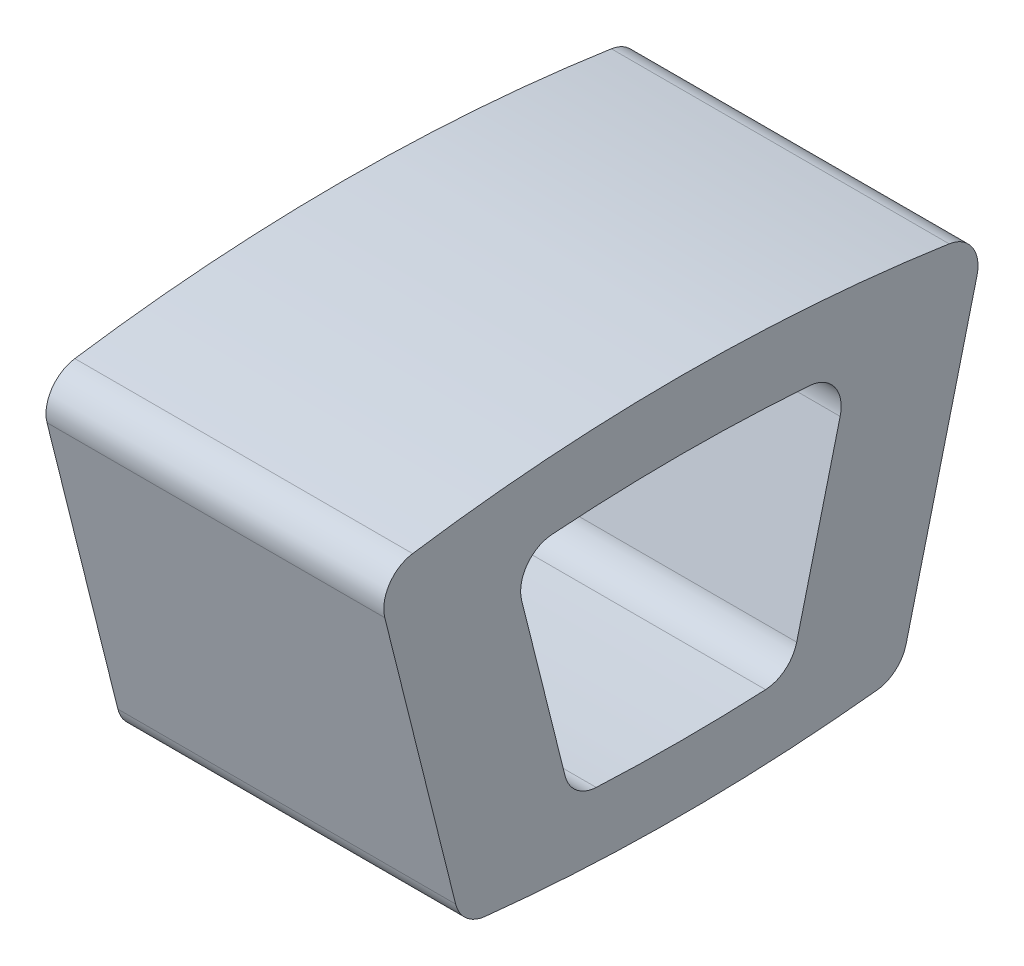
ISO-10303-21;
HEADER;
FILE_DESCRIPTION(('STEP AP214'),'2;1');
FILE_NAME('part.step','',(''),(''),'','','');
FILE_SCHEMA(('AUTOMOTIVE_DESIGN { 1 0 10303 214 1 1 1 1 }'));
ENDSEC;
DATA;
#1=APPLICATION_CONTEXT('core data for automotive mechanical design processes');
#2=APPLICATION_PROTOCOL_DEFINITION('international standard','automotive_design',2000,#1);
#3=PRODUCT_CONTEXT('',#1,'mechanical');
#4=PRODUCT('Part','Part','',(#3));
#5=PRODUCT_RELATED_PRODUCT_CATEGORY('part','',(#4));
#6=PRODUCT_DEFINITION_FORMATION('','',#4);
#7=PRODUCT_DEFINITION_CONTEXT('part definition',#1,'design');
#8=PRODUCT_DEFINITION('design','',#6,#7);
#9=PRODUCT_DEFINITION_SHAPE('','',#8);
#10=(LENGTH_UNIT() NAMED_UNIT(*) SI_UNIT(.MILLI.,.METRE.));
#11=(NAMED_UNIT(*) PLANE_ANGLE_UNIT() SI_UNIT($,.RADIAN.));
#12=(NAMED_UNIT(*) SI_UNIT($,.STERADIAN.) SOLID_ANGLE_UNIT());
#13=UNCERTAINTY_MEASURE_WITH_UNIT(LENGTH_MEASURE(1.E-05),#10,'distance_accuracy_value','');
#14=(GEOMETRIC_REPRESENTATION_CONTEXT(3) GLOBAL_UNCERTAINTY_ASSIGNED_CONTEXT((#13)) GLOBAL_UNIT_ASSIGNED_CONTEXT((#10,
#11,#12)) REPRESENTATION_CONTEXT('',''));
#15=CARTESIAN_POINT('',(0.,0.,0.));
#16=DIRECTION('',(0.,0.,1.));
#17=DIRECTION('',(1.,0.,0.));
#18=AXIS2_PLACEMENT_3D('',#15,#16,#17);
#19=CARTESIAN_POINT('',(40.,177.159717930252,-22.7918238569453));
#20=DIRECTION('',(1.,0.,0.));
#21=DIRECTION('',(0.,0.,-1.));
#22=AXIS2_PLACEMENT_3D('',#19,#20,#21);
#23=PLANE('',#22);
#24=CARTESIAN_POINT('',(40.,177.159717930252,-22.7918238569453));
#25=DIRECTION('',(1.,0.,0.));
#26=DIRECTION('',(0.,0.,-1.));
#27=AXIS2_PLACEMENT_3D('',#24,#25,#26);
#28=CIRCLE('',#27,4.00000000000001);
#29=CARTESIAN_POINT('',(40.,173.182678406543,-23.2197918777813));
#30=VERTEX_POINT('',#29);
#31=CARTESIAN_POINT('',(40.,176.189575430106,-26.6723938575266));
#32=VERTEX_POINT('',#31);
#33=EDGE_CURVE('E222',#30,#32,#28,.T.);
#34=ORIENTED_EDGE('',*,*,#33,.T.);
#35=DIRECTION('',(0.,0.970142500145332,-0.242535625036332));
#36=VECTOR('',#35,1.);
#37=CARTESIAN_POINT('',(40.,176.189575430106,-26.6723938575266));
#38=LINE('',#37,#36);
#39=CARTESIAN_POINT('',(40.,209.758625875981,-35.0646564689952));
#40=VERTEX_POINT('',#39);
#41=EDGE_CURVE('E225',#32,#40,#38,.T.);
#42=ORIENTED_EDGE('',*,*,#41,.T.);
#43=CARTESIAN_POINT('',(40.,210.728768376126,-31.1840864684138));
#44=DIRECTION('',(1.,0.,0.));
#45=DIRECTION('',(0.,0.,1.));
#46=AXIS2_PLACEMENT_3D('',#43,#44,#45);
#47=CIRCLE('',#46,4.00000000000003);
#48=CARTESIAN_POINT('',(40.,214.685677419528,-31.7696381930689));
#49=VERTEX_POINT('',#48);
#50=EDGE_CURVE('E227',#40,#49,#47,.T.);
#51=ORIENTED_EDGE('',*,*,#50,.T.);
#52=CARTESIAN_POINT('',(40.,0.,0.));
#53=DIRECTION('',(1.,0.,0.));
#54=DIRECTION('',(0.,0.,1.));
#55=AXIS2_PLACEMENT_3D('',#52,#53,#54);
#56=CIRCLE('',#55,217.023616226437);
#57=CARTESIAN_POINT('',(40.,214.685677419528,31.7696381930689));
#58=VERTEX_POINT('',#57);
#59=EDGE_CURVE('E229',#49,#58,#56,.T.);
#60=ORIENTED_EDGE('',*,*,#59,.T.);
#61=CARTESIAN_POINT('',(40.,210.728768376126,31.1840864684138));
#62=DIRECTION('',(1.,0.,0.));
#63=DIRECTION('',(0.,0.,1.));
#64=AXIS2_PLACEMENT_3D('',#61,#62,#63);
#65=CIRCLE('',#64,4.00000000000002);
#66=CARTESIAN_POINT('',(40.,209.758625875981,35.0646564689952));
#67=VERTEX_POINT('',#66);
#68=EDGE_CURVE('E231',#58,#67,#65,.T.);
#69=ORIENTED_EDGE('',*,*,#68,.T.);
#70=DIRECTION('',(0.,-0.970142500145332,-0.242535625036332));
#71=VECTOR('',#70,1.);
#72=CARTESIAN_POINT('',(40.,176.189575430106,26.6723938575266));
#73=LINE('',#72,#71);
#74=CARTESIAN_POINT('',(40.,176.189575430106,26.6723938575266));
#75=VERTEX_POINT('',#74);
#76=EDGE_CURVE('E233',#67,#75,#73,.T.);
#77=ORIENTED_EDGE('',*,*,#76,.T.);
#78=CARTESIAN_POINT('',(40.,177.159717930252,22.7918238569453));
#79=DIRECTION('',(1.,0.,0.));
#80=DIRECTION('',(0.,0.,-1.));
#81=AXIS2_PLACEMENT_3D('',#78,#79,#80);
#82=CIRCLE('',#81,4.00000000000001);
#83=CARTESIAN_POINT('',(40.,173.182678406543,23.2197918777813));
#84=VERTEX_POINT('',#83);
#85=EDGE_CURVE('E235',#75,#84,#82,.T.);
#86=ORIENTED_EDGE('',*,*,#85,.T.);
#87=CARTESIAN_POINT('',(40.,388.960553234229,0.));
#88=DIRECTION('',(1.,0.,0.));
#89=DIRECTION('',(0.,0.,-1.));
#90=AXIS2_PLACEMENT_3D('',#87,#88,#89);
#91=CIRCLE('',#90,217.023616226437);
#92=EDGE_CURVE('E237',#84,#30,#91,.T.);
#93=ORIENTED_EDGE('',*,*,#92,.T.);
#94=EDGE_LOOP('',(#34,#42,#51,#60,#69,#77,#86,#93));
#95=FACE_BOUND('',#94,.T.);
#96=DIRECTION('',(0.,0.970142500145332,-0.242535625036333));
#97=VECTOR('',#96,1.);
#98=CARTESIAN_POINT('',(40.,182.861170071266,-13.7152925178166));
#99=LINE('',#98,#97);
#100=CARTESIAN_POINT('',(40.,182.861170071266,-13.7152925178166));
#101=VERTEX_POINT('',#100);
#102=CARTESIAN_POINT('',(40.,203.441046598239,-18.8602616495598));
#103=VERTEX_POINT('',#102);
#104=EDGE_CURVE('E180',#101,#103,#99,.T.);
#105=ORIENTED_EDGE('',*,*,#104,.F.);
#106=CARTESIAN_POINT('',(40.,183.831312571412,-9.83472251723527));
#107=DIRECTION('',(1.,0.,0.));
#108=DIRECTION('',(0.,0.,-1.));
#109=AXIS2_PLACEMENT_3D('',#106,#107,#108);
#110=CIRCLE('',#109,3.99999999999998);
#111=CARTESIAN_POINT('',(40.,179.83592011072,-10.0266576235856));
#112=VERTEX_POINT('',#111);
#113=EDGE_CURVE('E157',#112,#101,#110,.T.);
#114=ORIENTED_EDGE('',*,*,#113,.F.);
#115=CARTESIAN_POINT('',(40.,388.554549219143,0.));
#116=DIRECTION('',(1.,0.,0.));
#117=DIRECTION('',(0.,0.,-1.));
#118=AXIS2_PLACEMENT_3D('',#115,#116,#117);
#119=CIRCLE('',#118,208.959326185744);
#120=CARTESIAN_POINT('',(40.,179.83592011072,10.0266576235856));
#121=VERTEX_POINT('',#120);
#122=EDGE_CURVE('E192',#121,#112,#119,.T.);
#123=ORIENTED_EDGE('',*,*,#122,.F.);
#124=CARTESIAN_POINT('',(40.,183.831312571412,9.83472251723527));
#125=DIRECTION('',(1.,0.,0.));
#126=DIRECTION('',(0.,0.,-1.));
#127=AXIS2_PLACEMENT_3D('',#124,#125,#126);
#128=CIRCLE('',#127,3.99999999999998);
#129=CARTESIAN_POINT('',(40.,182.861170071266,13.7152925178166));
#130=VERTEX_POINT('',#129);
#131=EDGE_CURVE('E190',#130,#121,#128,.T.);
#132=ORIENTED_EDGE('',*,*,#131,.F.);
#133=DIRECTION('',(0.,-0.970142500145332,-0.242535625036333));
#134=VECTOR('',#133,1.);
#135=CARTESIAN_POINT('',(40.,182.861170071266,13.7152925178166));
#136=LINE('',#135,#134);
#137=CARTESIAN_POINT('',(40.,203.441046598239,18.8602616495598));
#138=VERTEX_POINT('',#137);
#139=EDGE_CURVE('E188',#138,#130,#136,.T.);
#140=ORIENTED_EDGE('',*,*,#139,.F.);
#141=CARTESIAN_POINT('',(40.,204.411189098385,14.9796916489785));
#142=DIRECTION('',(1.,0.,0.));
#143=DIRECTION('',(0.,0.,1.));
#144=AXIS2_PLACEMENT_3D('',#141,#142,#143);
#145=CIRCLE('',#144,4.00000000000002);
#146=CARTESIAN_POINT('',(40.,208.400491618108,15.2720363190698));
#147=VERTEX_POINT('',#146);
#148=EDGE_CURVE('E186',#147,#138,#145,.T.);
#149=ORIENTED_EDGE('',*,*,#148,.F.);
#150=CARTESIAN_POINT('',(40.,0.,0.));
#151=DIRECTION('',(1.,0.,0.));
#152=DIRECTION('',(0.,0.,1.));
#153=AXIS2_PLACEMENT_3D('',#150,#151,#152);
#154=CIRCLE('',#153,208.959326185744);
#155=CARTESIAN_POINT('',(40.,208.400491618108,-15.2720363190698));
#156=VERTEX_POINT('',#155);
#157=EDGE_CURVE('E184',#156,#147,#154,.T.);
#158=ORIENTED_EDGE('',*,*,#157,.F.);
#159=CARTESIAN_POINT('',(40.,204.411189098385,-14.9796916489785));
#160=DIRECTION('',(1.,0.,0.));
#161=DIRECTION('',(0.,0.,1.));
#162=AXIS2_PLACEMENT_3D('',#159,#160,#161);
#163=CIRCLE('',#162,4.00000000000002);
#164=EDGE_CURVE('E182',#103,#156,#163,.T.);
#165=ORIENTED_EDGE('',*,*,#164,.F.);
#166=EDGE_LOOP('',(#105,#114,#123,#132,#140,#149,#158,#165));
#167=FACE_BOUND('',#166,.T.);
#168=ADVANCED_FACE('F29',(#95,#167),#23,.T.);
#169=CARTESIAN_POINT('',(0.,177.159717930252,-22.7918238569453));
#170=DIRECTION('',(1.,0.,0.));
#171=DIRECTION('',(0.,0.,-1.));
#172=AXIS2_PLACEMENT_3D('',#169,#170,#171);
#173=PLANE('',#172);
#174=CARTESIAN_POINT('',(0.,177.159717930252,-22.7918238569453));
#175=DIRECTION('',(1.,0.,0.));
#176=DIRECTION('',(0.,0.,-1.));
#177=AXIS2_PLACEMENT_3D('',#174,#175,#176);
#178=CIRCLE('',#177,4.00000000000001);
#179=CARTESIAN_POINT('',(0.,173.182678406543,-23.2197918777813));
#180=VERTEX_POINT('',#179);
#181=CARTESIAN_POINT('',(0.,176.189575430106,-26.6723938575266));
#182=VERTEX_POINT('',#181);
#183=EDGE_CURVE('E158',#180,#182,#178,.T.);
#184=ORIENTED_EDGE('',*,*,#183,.F.);
#185=CARTESIAN_POINT('',(0.,388.960553234229,0.));
#186=DIRECTION('',(1.,0.,0.));
#187=DIRECTION('',(0.,0.,-1.));
#188=AXIS2_PLACEMENT_3D('',#185,#186,#187);
#189=CIRCLE('',#188,217.023616226437);
#190=CARTESIAN_POINT('',(0.,173.182678406543,23.2197918777813));
#191=VERTEX_POINT('',#190);
#192=EDGE_CURVE('E220',#191,#180,#189,.T.);
#193=ORIENTED_EDGE('',*,*,#192,.F.);
#194=CARTESIAN_POINT('',(0.,177.159717930252,22.7918238569453));
#195=DIRECTION('',(1.,0.,0.));
#196=DIRECTION('',(0.,0.,-1.));
#197=AXIS2_PLACEMENT_3D('',#194,#195,#196);
#198=CIRCLE('',#197,4.00000000000001);
#199=CARTESIAN_POINT('',(0.,176.189575430106,26.6723938575266));
#200=VERTEX_POINT('',#199);
#201=EDGE_CURVE('E218',#200,#191,#198,.T.);
#202=ORIENTED_EDGE('',*,*,#201,.F.);
#203=DIRECTION('',(0.,-0.970142500145332,-0.242535625036332));
#204=VECTOR('',#203,1.);
#205=CARTESIAN_POINT('',(0.,176.189575430106,26.6723938575266));
#206=LINE('',#205,#204);
#207=CARTESIAN_POINT('',(0.,209.758625875981,35.0646564689952));
#208=VERTEX_POINT('',#207);
#209=EDGE_CURVE('E216',#208,#200,#206,.T.);
#210=ORIENTED_EDGE('',*,*,#209,.F.);
#211=CARTESIAN_POINT('',(0.,210.728768376126,31.1840864684138));
#212=DIRECTION('',(1.,0.,0.));
#213=DIRECTION('',(0.,0.,1.));
#214=AXIS2_PLACEMENT_3D('',#211,#212,#213);
#215=CIRCLE('',#214,4.00000000000002);
#216=CARTESIAN_POINT('',(0.,214.685677419528,31.7696381930689));
#217=VERTEX_POINT('',#216);
#218=EDGE_CURVE('E214',#217,#208,#215,.T.);
#219=ORIENTED_EDGE('',*,*,#218,.F.);
#220=CARTESIAN_POINT('',(0.,0.,0.));
#221=DIRECTION('',(1.,0.,0.));
#222=DIRECTION('',(0.,0.,1.));
#223=AXIS2_PLACEMENT_3D('',#220,#221,#222);
#224=CIRCLE('',#223,217.023616226437);
#225=CARTESIAN_POINT('',(0.,214.685677419528,-31.7696381930689));
#226=VERTEX_POINT('',#225);
#227=EDGE_CURVE('E212',#226,#217,#224,.T.);
#228=ORIENTED_EDGE('',*,*,#227,.F.);
#229=CARTESIAN_POINT('',(0.,210.728768376126,-31.1840864684138));
#230=DIRECTION('',(1.,0.,0.));
#231=DIRECTION('',(0.,0.,1.));
#232=AXIS2_PLACEMENT_3D('',#229,#230,#231);
#233=CIRCLE('',#232,4.00000000000003);
#234=CARTESIAN_POINT('',(0.,209.758625875981,-35.0646564689952));
#235=VERTEX_POINT('',#234);
#236=EDGE_CURVE('E210',#235,#226,#233,.T.);
#237=ORIENTED_EDGE('',*,*,#236,.F.);
#238=DIRECTION('',(0.,0.970142500145332,-0.242535625036332));
#239=VECTOR('',#238,1.);
#240=CARTESIAN_POINT('',(0.,176.189575430106,-26.6723938575266));
#241=LINE('',#240,#239);
#242=EDGE_CURVE('E208',#182,#235,#241,.T.);
#243=ORIENTED_EDGE('',*,*,#242,.F.);
#244=EDGE_LOOP('',(#184,#193,#202,#210,#219,#228,#237,#243));
#245=FACE_BOUND('',#244,.T.);
#246=CARTESIAN_POINT('',(0.,183.831312571412,-9.83472251723527));
#247=DIRECTION('',(1.,0.,0.));
#248=DIRECTION('',(0.,0.,-1.));
#249=AXIS2_PLACEMENT_3D('',#246,#247,#248);
#250=CIRCLE('',#249,3.99999999999998);
#251=CARTESIAN_POINT('',(0.,179.83592011072,-10.0266576235856));
#252=VERTEX_POINT('',#251);
#253=CARTESIAN_POINT('',(0.,182.861170071266,-13.7152925178166));
#254=VERTEX_POINT('',#253);
#255=EDGE_CURVE('E52',#252,#254,#250,.T.);
#256=ORIENTED_EDGE('',*,*,#255,.T.);
#257=DIRECTION('',(0.,0.970142500145332,-0.242535625036333));
#258=VECTOR('',#257,1.);
#259=CARTESIAN_POINT('',(0.,182.861170071266,-13.7152925178166));
#260=LINE('',#259,#258);
#261=CARTESIAN_POINT('',(0.,203.441046598239,-18.8602616495598));
#262=VERTEX_POINT('',#261);
#263=EDGE_CURVE('E144',#254,#262,#260,.T.);
#264=ORIENTED_EDGE('',*,*,#263,.T.);
#265=CARTESIAN_POINT('',(0.,204.411189098385,-14.9796916489785));
#266=DIRECTION('',(1.,0.,0.));
#267=DIRECTION('',(0.,0.,1.));
#268=AXIS2_PLACEMENT_3D('',#265,#266,#267);
#269=CIRCLE('',#268,4.00000000000002);
#270=CARTESIAN_POINT('',(0.,208.400491618108,-15.2720363190698));
#271=VERTEX_POINT('',#270);
#272=EDGE_CURVE('E153',#262,#271,#269,.T.);
#273=ORIENTED_EDGE('',*,*,#272,.T.);
#274=CARTESIAN_POINT('',(0.,0.,0.));
#275=DIRECTION('',(1.,0.,0.));
#276=DIRECTION('',(0.,0.,1.));
#277=AXIS2_PLACEMENT_3D('',#274,#275,#276);
#278=CIRCLE('',#277,208.959326185744);
#279=CARTESIAN_POINT('',(0.,208.400491618108,15.2720363190698));
#280=VERTEX_POINT('',#279);
#281=EDGE_CURVE('E167',#271,#280,#278,.T.);
#282=ORIENTED_EDGE('',*,*,#281,.T.);
#283=CARTESIAN_POINT('',(0.,204.411189098385,14.9796916489785));
#284=DIRECTION('',(1.,0.,0.));
#285=DIRECTION('',(0.,0.,1.));
#286=AXIS2_PLACEMENT_3D('',#283,#284,#285);
#287=CIRCLE('',#286,4.00000000000002);
#288=CARTESIAN_POINT('',(0.,203.441046598239,18.8602616495598));
#289=VERTEX_POINT('',#288);
#290=EDGE_CURVE('E170',#280,#289,#287,.T.);
#291=ORIENTED_EDGE('',*,*,#290,.T.);
#292=DIRECTION('',(0.,-0.970142500145332,-0.242535625036333));
#293=VECTOR('',#292,1.);
#294=CARTESIAN_POINT('',(0.,182.861170071266,13.7152925178166));
#295=LINE('',#294,#293);
#296=CARTESIAN_POINT('',(0.,182.861170071266,13.7152925178166));
#297=VERTEX_POINT('',#296);
#298=EDGE_CURVE('E173',#289,#297,#295,.T.);
#299=ORIENTED_EDGE('',*,*,#298,.T.);
#300=CARTESIAN_POINT('',(0.,183.831312571412,9.83472251723527));
#301=DIRECTION('',(1.,0.,0.));
#302=DIRECTION('',(0.,0.,-1.));
#303=AXIS2_PLACEMENT_3D('',#300,#301,#302);
#304=CIRCLE('',#303,3.99999999999998);
#305=CARTESIAN_POINT('',(0.,179.83592011072,10.0266576235856));
#306=VERTEX_POINT('',#305);
#307=EDGE_CURVE('E176',#297,#306,#304,.T.);
#308=ORIENTED_EDGE('',*,*,#307,.T.);
#309=CARTESIAN_POINT('',(0.,388.554549219143,0.));
#310=DIRECTION('',(1.,0.,0.));
#311=DIRECTION('',(0.,0.,-1.));
#312=AXIS2_PLACEMENT_3D('',#309,#310,#311);
#313=CIRCLE('',#312,208.959326185744);
#314=EDGE_CURVE('E163',#306,#252,#313,.T.);
#315=ORIENTED_EDGE('',*,*,#314,.T.);
#316=EDGE_LOOP('',(#256,#264,#273,#282,#291,#299,#308,#315));
#317=FACE_BOUND('',#316,.T.);
#318=ADVANCED_FACE('F161',(#245,#317),#173,.F.);
#319=CARTESIAN_POINT('',(40.,177.159717930252,-22.7918238569453));
#320=DIRECTION('',(-1.,0.,0.));
#321=DIRECTION('',(0.,0.,1.));
#322=AXIS2_PLACEMENT_3D('',#319,#320,#321);
#323=CYLINDRICAL_SURFACE('',#322,4.00000000000001);
#324=ORIENTED_EDGE('',*,*,#183,.T.);
#325=DIRECTION('',(-1.,0.,0.));
#326=VECTOR('',#325,1.);
#327=CARTESIAN_POINT('',(40.,176.189575430106,-26.6723938575266));
#328=LINE('',#327,#326);
#329=EDGE_CURVE('E11',#32,#182,#328,.T.);
#330=ORIENTED_EDGE('',*,*,#329,.F.);
#331=ORIENTED_EDGE('',*,*,#33,.F.);
#332=DIRECTION('',(-1.,0.,0.));
#333=VECTOR('',#332,1.);
#334=CARTESIAN_POINT('',(40.,173.182678406543,-23.2197918777813));
#335=LINE('',#334,#333);
#336=EDGE_CURVE('E239',#30,#180,#335,.T.);
#337=ORIENTED_EDGE('',*,*,#336,.T.);
#338=EDGE_LOOP('',(#324,#330,#331,#337));
#339=FACE_BOUND('',#338,.T.);
#340=ADVANCED_FACE('F31',(#339),#323,.T.);
#341=CARTESIAN_POINT('',(40.,176.189575430106,-26.6723938575266));
#342=DIRECTION('',(0.,0.242535625036333,0.970142500145332));
#343=DIRECTION('',(0.,-0.970142500145332,0.242535625036333));
#344=AXIS2_PLACEMENT_3D('',#341,#342,#343);
#345=PLANE('',#344);
#346=ORIENTED_EDGE('',*,*,#242,.T.);
#347=DIRECTION('',(-1.,0.,0.));
#348=VECTOR('',#347,1.);
#349=CARTESIAN_POINT('',(40.,209.758625875981,-35.0646564689952));
#350=LINE('',#349,#348);
#351=EDGE_CURVE('E37',#40,#235,#350,.T.);
#352=ORIENTED_EDGE('',*,*,#351,.F.);
#353=ORIENTED_EDGE('',*,*,#41,.F.);
#354=ORIENTED_EDGE('',*,*,#329,.T.);
#355=EDGE_LOOP('',(#346,#352,#353,#354));
#356=FACE_BOUND('',#355,.T.);
#357=ADVANCED_FACE('F283',(#356),#345,.F.);
#358=CARTESIAN_POINT('',(40.,210.728768376126,-31.1840864684138));
#359=DIRECTION('',(-1.,0.,0.));
#360=DIRECTION('',(0.,0.,1.));
#361=AXIS2_PLACEMENT_3D('',#358,#359,#360);
#362=CYLINDRICAL_SURFACE('',#361,4.00000000000003);
#363=ORIENTED_EDGE('',*,*,#236,.T.);
#364=DIRECTION('',(-1.,0.,0.));
#365=VECTOR('',#364,1.);
#366=CARTESIAN_POINT('',(40.,214.685677419528,-31.7696381930689));
#367=LINE('',#366,#365);
#368=EDGE_CURVE('E254',#49,#226,#367,.T.);
#369=ORIENTED_EDGE('',*,*,#368,.F.);
#370=ORIENTED_EDGE('',*,*,#50,.F.);
#371=ORIENTED_EDGE('',*,*,#351,.T.);
#372=EDGE_LOOP('',(#363,#369,#370,#371));
#373=FACE_BOUND('',#372,.T.);
#374=ADVANCED_FACE('F261',(#373),#362,.T.);
#375=CARTESIAN_POINT('',(40.,0.,0.));
#376=DIRECTION('',(-1.,0.,0.));
#377=DIRECTION('',(0.,0.,1.));
#378=AXIS2_PLACEMENT_3D('',#375,#376,#377);
#379=CYLINDRICAL_SURFACE('',#378,217.023616226437);
#380=ORIENTED_EDGE('',*,*,#227,.T.);
#381=DIRECTION('',(-1.,0.,0.));
#382=VECTOR('',#381,1.);
#383=CARTESIAN_POINT('',(40.,214.685677419528,31.7696381930689));
#384=LINE('',#383,#382);
#385=EDGE_CURVE('E251',#58,#217,#384,.T.);
#386=ORIENTED_EDGE('',*,*,#385,.F.);
#387=ORIENTED_EDGE('',*,*,#59,.F.);
#388=ORIENTED_EDGE('',*,*,#368,.T.);
#389=EDGE_LOOP('',(#380,#386,#387,#388));
#390=FACE_BOUND('',#389,.T.);
#391=ADVANCED_FACE('F271',(#390),#379,.T.);
#392=CARTESIAN_POINT('',(40.,210.728768376126,31.1840864684138));
#393=DIRECTION('',(-1.,0.,0.));
#394=DIRECTION('',(0.,0.,1.));
#395=AXIS2_PLACEMENT_3D('',#392,#393,#394);
#396=CYLINDRICAL_SURFACE('',#395,4.00000000000002);
#397=ORIENTED_EDGE('',*,*,#218,.T.);
#398=DIRECTION('',(-1.,0.,0.));
#399=VECTOR('',#398,1.);
#400=CARTESIAN_POINT('',(40.,209.758625875981,35.0646564689952));
#401=LINE('',#400,#399);
#402=EDGE_CURVE('E248',#67,#208,#401,.T.);
#403=ORIENTED_EDGE('',*,*,#402,.F.);
#404=ORIENTED_EDGE('',*,*,#68,.F.);
#405=ORIENTED_EDGE('',*,*,#385,.T.);
#406=EDGE_LOOP('',(#397,#403,#404,#405));
#407=FACE_BOUND('',#406,.T.);
#408=ADVANCED_FACE('F275',(#407),#396,.T.);
#409=CARTESIAN_POINT('',(40.,176.189575430106,26.6723938575266));
#410=DIRECTION('',(0.,0.242535625036332,-0.970142500145332));
#411=DIRECTION('',(0.,0.970142500145332,0.242535625036332));
#412=AXIS2_PLACEMENT_3D('',#409,#410,#411);
#413=PLANE('',#412);
#414=ORIENTED_EDGE('',*,*,#209,.T.);
#415=DIRECTION('',(-1.,0.,0.));
#416=VECTOR('',#415,1.);
#417=CARTESIAN_POINT('',(40.,176.189575430106,26.6723938575266));
#418=LINE('',#417,#416);
#419=EDGE_CURVE('E245',#75,#200,#418,.T.);
#420=ORIENTED_EDGE('',*,*,#419,.F.);
#421=ORIENTED_EDGE('',*,*,#76,.F.);
#422=ORIENTED_EDGE('',*,*,#402,.T.);
#423=EDGE_LOOP('',(#414,#420,#421,#422));
#424=FACE_BOUND('',#423,.T.);
#425=ADVANCED_FACE('F296',(#424),#413,.F.);
#426=CARTESIAN_POINT('',(40.,177.159717930252,22.7918238569453));
#427=DIRECTION('',(-1.,0.,0.));
#428=DIRECTION('',(0.,0.,1.));
#429=AXIS2_PLACEMENT_3D('',#426,#427,#428);
#430=CYLINDRICAL_SURFACE('',#429,4.00000000000001);
#431=ORIENTED_EDGE('',*,*,#201,.T.);
#432=DIRECTION('',(-1.,0.,0.));
#433=VECTOR('',#432,1.);
#434=CARTESIAN_POINT('',(40.,173.182678406543,23.2197918777813));
#435=LINE('',#434,#433);
#436=EDGE_CURVE('E242',#84,#191,#435,.T.);
#437=ORIENTED_EDGE('',*,*,#436,.F.);
#438=ORIENTED_EDGE('',*,*,#85,.F.);
#439=ORIENTED_EDGE('',*,*,#419,.T.);
#440=EDGE_LOOP('',(#431,#437,#438,#439));
#441=FACE_BOUND('',#440,.T.);
#442=ADVANCED_FACE('F294',(#441),#430,.T.);
#443=CARTESIAN_POINT('',(40.,388.960553234229,0.));
#444=DIRECTION('',(-1.,0.,0.));
#445=DIRECTION('',(0.,0.,1.));
#446=AXIS2_PLACEMENT_3D('',#443,#444,#445);
#447=CYLINDRICAL_SURFACE('',#446,217.023616226437);
#448=ORIENTED_EDGE('',*,*,#192,.T.);
#449=ORIENTED_EDGE('',*,*,#336,.F.);
#450=ORIENTED_EDGE('',*,*,#92,.F.);
#451=ORIENTED_EDGE('',*,*,#436,.T.);
#452=EDGE_LOOP('',(#448,#449,#450,#451));
#453=FACE_BOUND('',#452,.T.);
#454=ADVANCED_FACE('F289',(#453),#447,.T.);
#455=CARTESIAN_POINT('',(40.,183.831312571412,-9.83472251723527));
#456=DIRECTION('',(-1.,0.,0.));
#457=DIRECTION('',(0.,0.,1.));
#458=AXIS2_PLACEMENT_3D('',#455,#456,#457);
#459=CYLINDRICAL_SURFACE('',#458,3.99999999999998);
#460=ORIENTED_EDGE('',*,*,#255,.F.);
#461=DIRECTION('',(-1.,0.,0.));
#462=VECTOR('',#461,1.);
#463=CARTESIAN_POINT('',(40.,179.83592011072,-10.0266576235856));
#464=LINE('',#463,#462);
#465=EDGE_CURVE('E194',#112,#252,#464,.T.);
#466=ORIENTED_EDGE('',*,*,#465,.F.);
#467=ORIENTED_EDGE('',*,*,#113,.T.);
#468=DIRECTION('',(-1.,0.,0.));
#469=VECTOR('',#468,1.);
#470=CARTESIAN_POINT('',(40.,182.861170071266,-13.7152925178166));
#471=LINE('',#470,#469);
#472=EDGE_CURVE('E146',#101,#254,#471,.T.);
#473=ORIENTED_EDGE('',*,*,#472,.T.);
#474=EDGE_LOOP('',(#460,#466,#467,#473));
#475=FACE_BOUND('',#474,.T.);
#476=ADVANCED_FACE('F155',(#475),#459,.F.);
#477=CARTESIAN_POINT('',(40.,182.861170071266,-13.7152925178166));
#478=DIRECTION('',(0.,0.242535625036333,0.970142500145332));
#479=DIRECTION('',(0.,-0.970142500145332,0.242535625036333));
#480=AXIS2_PLACEMENT_3D('',#477,#478,#479);
#481=PLANE('',#480);
#482=ORIENTED_EDGE('',*,*,#263,.F.);
#483=ORIENTED_EDGE('',*,*,#472,.F.);
#484=ORIENTED_EDGE('',*,*,#104,.T.);
#485=DIRECTION('',(-1.,0.,0.));
#486=VECTOR('',#485,1.);
#487=CARTESIAN_POINT('',(40.,203.441046598239,-18.8602616495598));
#488=LINE('',#487,#486);
#489=EDGE_CURVE('E149',#103,#262,#488,.T.);
#490=ORIENTED_EDGE('',*,*,#489,.T.);
#491=EDGE_LOOP('',(#482,#483,#484,#490));
#492=FACE_BOUND('',#491,.T.);
#493=ADVANCED_FACE('F145',(#492),#481,.T.);
#494=CARTESIAN_POINT('',(40.,204.411189098385,-14.9796916489785));
#495=DIRECTION('',(-1.,0.,0.));
#496=DIRECTION('',(0.,0.,1.));
#497=AXIS2_PLACEMENT_3D('',#494,#495,#496);
#498=CYLINDRICAL_SURFACE('',#497,4.00000000000002);
#499=ORIENTED_EDGE('',*,*,#272,.F.);
#500=ORIENTED_EDGE('',*,*,#489,.F.);
#501=ORIENTED_EDGE('',*,*,#164,.T.);
#502=DIRECTION('',(-1.,0.,0.));
#503=VECTOR('',#502,1.);
#504=CARTESIAN_POINT('',(40.,208.400491618108,-15.2720363190698));
#505=LINE('',#504,#503);
#506=EDGE_CURVE('E203',#156,#271,#505,.T.);
#507=ORIENTED_EDGE('',*,*,#506,.T.);
#508=EDGE_LOOP('',(#499,#500,#501,#507));
#509=FACE_BOUND('',#508,.T.);
#510=ADVANCED_FACE('F320',(#509),#498,.F.);
#511=CARTESIAN_POINT('',(40.,0.,0.));
#512=DIRECTION('',(-1.,0.,0.));
#513=DIRECTION('',(0.,0.,1.));
#514=AXIS2_PLACEMENT_3D('',#511,#512,#513);
#515=CYLINDRICAL_SURFACE('',#514,208.959326185744);
#516=ORIENTED_EDGE('',*,*,#281,.F.);
#517=ORIENTED_EDGE('',*,*,#506,.F.);
#518=ORIENTED_EDGE('',*,*,#157,.T.);
#519=DIRECTION('',(-1.,0.,0.));
#520=VECTOR('',#519,1.);
#521=CARTESIAN_POINT('',(40.,208.400491618108,15.2720363190698));
#522=LINE('',#521,#520);
#523=EDGE_CURVE('E201',#147,#280,#522,.T.);
#524=ORIENTED_EDGE('',*,*,#523,.T.);
#525=EDGE_LOOP('',(#516,#517,#518,#524));
#526=FACE_BOUND('',#525,.T.);
#527=ADVANCED_FACE('F325',(#526),#515,.F.);
#528=CARTESIAN_POINT('',(40.,204.411189098385,14.9796916489785));
#529=DIRECTION('',(-1.,0.,0.));
#530=DIRECTION('',(0.,0.,1.));
#531=AXIS2_PLACEMENT_3D('',#528,#529,#530);
#532=CYLINDRICAL_SURFACE('',#531,4.00000000000002);
#533=ORIENTED_EDGE('',*,*,#290,.F.);
#534=ORIENTED_EDGE('',*,*,#523,.F.);
#535=ORIENTED_EDGE('',*,*,#148,.T.);
#536=DIRECTION('',(-1.,0.,0.));
#537=VECTOR('',#536,1.);
#538=CARTESIAN_POINT('',(40.,203.441046598239,18.8602616495598));
#539=LINE('',#538,#537);
#540=EDGE_CURVE('E199',#138,#289,#539,.T.);
#541=ORIENTED_EDGE('',*,*,#540,.T.);
#542=EDGE_LOOP('',(#533,#534,#535,#541));
#543=FACE_BOUND('',#542,.T.);
#544=ADVANCED_FACE('F329',(#543),#532,.F.);
#545=CARTESIAN_POINT('',(40.,182.861170071266,13.7152925178166));
#546=DIRECTION('',(0.,0.242535625036333,-0.970142500145332));
#547=DIRECTION('',(0.,0.970142500145332,0.242535625036333));
#548=AXIS2_PLACEMENT_3D('',#545,#546,#547);
#549=PLANE('',#548);
#550=ORIENTED_EDGE('',*,*,#298,.F.);
#551=ORIENTED_EDGE('',*,*,#540,.F.);
#552=ORIENTED_EDGE('',*,*,#139,.T.);
#553=DIRECTION('',(-1.,0.,0.));
#554=VECTOR('',#553,1.);
#555=CARTESIAN_POINT('',(40.,182.861170071266,13.7152925178166));
#556=LINE('',#555,#554);
#557=EDGE_CURVE('E197',#130,#297,#556,.T.);
#558=ORIENTED_EDGE('',*,*,#557,.T.);
#559=EDGE_LOOP('',(#550,#551,#552,#558));
#560=FACE_BOUND('',#559,.T.);
#561=ADVANCED_FACE('F333',(#560),#549,.T.);
#562=CARTESIAN_POINT('',(40.,183.831312571412,9.83472251723527));
#563=DIRECTION('',(-1.,0.,0.));
#564=DIRECTION('',(0.,0.,1.));
#565=AXIS2_PLACEMENT_3D('',#562,#563,#564);
#566=CYLINDRICAL_SURFACE('',#565,3.99999999999998);
#567=ORIENTED_EDGE('',*,*,#307,.F.);
#568=ORIENTED_EDGE('',*,*,#557,.F.);
#569=ORIENTED_EDGE('',*,*,#131,.T.);
#570=DIRECTION('',(-1.,0.,0.));
#571=VECTOR('',#570,1.);
#572=CARTESIAN_POINT('',(40.,179.83592011072,10.0266576235856));
#573=LINE('',#572,#571);
#574=EDGE_CURVE('E44',#121,#306,#573,.T.);
#575=ORIENTED_EDGE('',*,*,#574,.T.);
#576=EDGE_LOOP('',(#567,#568,#569,#575));
#577=FACE_BOUND('',#576,.T.);
#578=ADVANCED_FACE('F337',(#577),#566,.F.);
#579=CARTESIAN_POINT('',(40.,388.554549219143,0.));
#580=DIRECTION('',(-1.,0.,0.));
#581=DIRECTION('',(0.,0.,1.));
#582=AXIS2_PLACEMENT_3D('',#579,#580,#581);
#583=CYLINDRICAL_SURFACE('',#582,208.959326185744);
#584=ORIENTED_EDGE('',*,*,#314,.F.);
#585=ORIENTED_EDGE('',*,*,#574,.F.);
#586=ORIENTED_EDGE('',*,*,#122,.T.);
#587=ORIENTED_EDGE('',*,*,#465,.T.);
#588=EDGE_LOOP('',(#584,#585,#586,#587));
#589=FACE_BOUND('',#588,.T.);
#590=ADVANCED_FACE('F341',(#589),#583,.F.);
#591=CLOSED_SHELL('',(#168,#318,#340,#357,#374,#391,#408,#425,#442,#454,#476,#493,#510,#527,
#544,#561,#578,#590));
#592=MANIFOLD_SOLID_BREP('B2',#591);
#593=ADVANCED_BREP_SHAPE_REPRESENTATION('',(#18,#592),#14);
#594=SHAPE_DEFINITION_REPRESENTATION(#9,#593);
ENDSEC;
END-ISO-10303-21;
